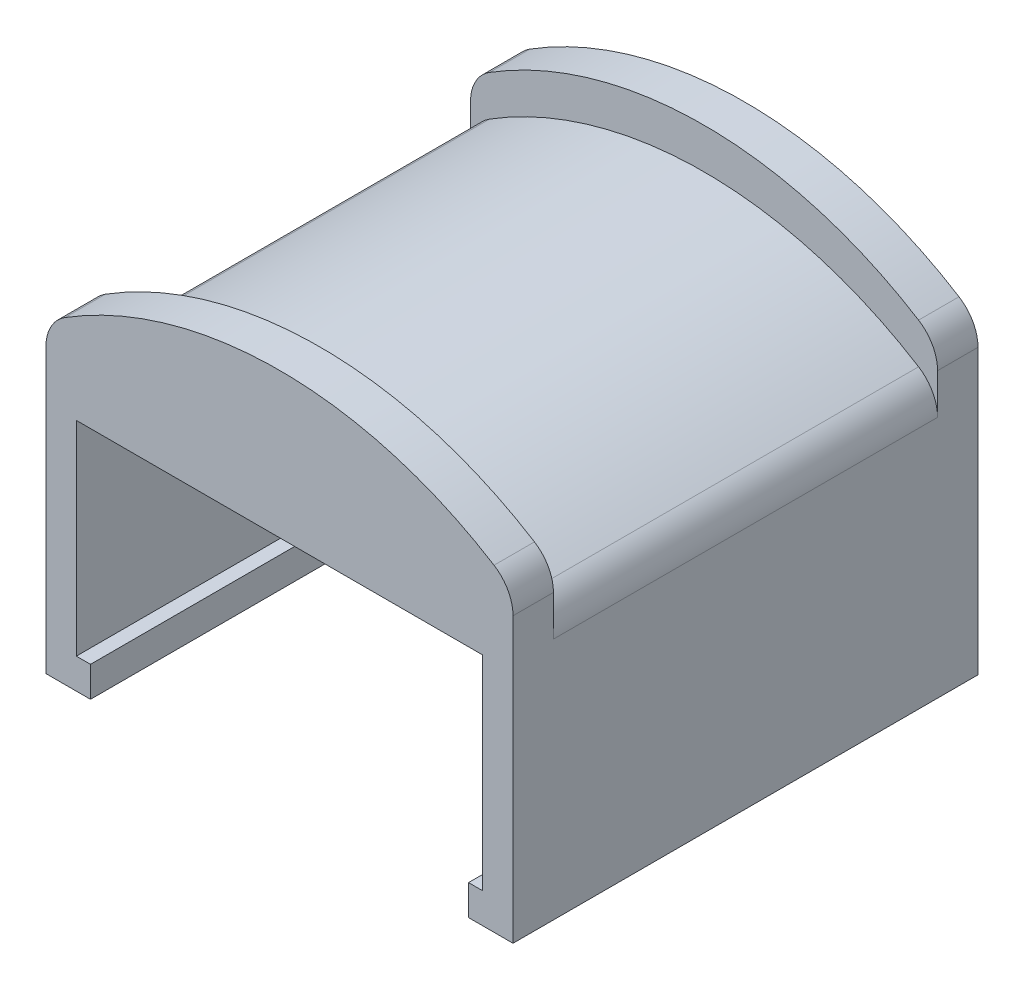
ISO-10303-21;
HEADER;
FILE_DESCRIPTION(('STEP AP214'),'2;1');
FILE_NAME('part.step','',(''),(''),'','','');
FILE_SCHEMA(('AUTOMOTIVE_DESIGN { 1 0 10303 214 1 1 1 1 }'));
ENDSEC;
DATA;
#1=APPLICATION_CONTEXT('core data for automotive mechanical design processes');
#2=APPLICATION_PROTOCOL_DEFINITION('international standard','automotive_design',2000,#1);
#3=PRODUCT_CONTEXT('',#1,'mechanical');
#4=PRODUCT('Part','Part','',(#3));
#5=PRODUCT_RELATED_PRODUCT_CATEGORY('part','',(#4));
#6=PRODUCT_DEFINITION_FORMATION('','',#4);
#7=PRODUCT_DEFINITION_CONTEXT('part definition',#1,'design');
#8=PRODUCT_DEFINITION('design','',#6,#7);
#9=PRODUCT_DEFINITION_SHAPE('','',#8);
#10=(LENGTH_UNIT() NAMED_UNIT(*) SI_UNIT(.MILLI.,.METRE.));
#11=(NAMED_UNIT(*) PLANE_ANGLE_UNIT() SI_UNIT($,.RADIAN.));
#12=(NAMED_UNIT(*) SI_UNIT($,.STERADIAN.) SOLID_ANGLE_UNIT());
#13=UNCERTAINTY_MEASURE_WITH_UNIT(LENGTH_MEASURE(1.E-05),#10,'distance_accuracy_value','');
#14=(GEOMETRIC_REPRESENTATION_CONTEXT(3) GLOBAL_UNCERTAINTY_ASSIGNED_CONTEXT((#13)) GLOBAL_UNIT_ASSIGNED_CONTEXT((#10,
#11,#12)) REPRESENTATION_CONTEXT('',''));
#15=CARTESIAN_POINT('',(0.,0.,0.));
#16=DIRECTION('',(0.,0.,1.));
#17=DIRECTION('',(1.,0.,0.));
#18=AXIS2_PLACEMENT_3D('',#15,#16,#17);
#19=CARTESIAN_POINT('',(-25.527,0.,24.13));
#20=DIRECTION('',(-1.,0.,0.));
#21=DIRECTION('',(0.,0.,1.));
#22=AXIS2_PLACEMENT_3D('',#19,#20,#21);
#23=PLANE('',#22);
#24=DIRECTION('',(0.,0.,-1.));
#25=VECTOR('',#24,1.);
#26=CARTESIAN_POINT('',(-25.527,-25.654,24.13));
#27=LINE('',#26,#25);
#28=CARTESIAN_POINT('',(-25.527,-25.654,29.21));
#29=VERTEX_POINT('',#28);
#30=CARTESIAN_POINT('',(-25.527,-25.654,-29.21));
#31=VERTEX_POINT('',#30);
#32=EDGE_CURVE('E183',#29,#31,#27,.T.);
#33=ORIENTED_EDGE('',*,*,#32,.T.);
#34=DIRECTION('',(0.,1.,0.));
#35=VECTOR('',#34,1.);
#36=CARTESIAN_POINT('',(-25.527,-25.654,-29.21));
#37=LINE('',#36,#35);
#38=CARTESIAN_POINT('',(-25.527,0.,-29.21));
#39=VERTEX_POINT('',#38);
#40=EDGE_CURVE('E185',#31,#39,#37,.T.);
#41=ORIENTED_EDGE('',*,*,#40,.T.);
#42=DIRECTION('',(0.,0.,-1.));
#43=VECTOR('',#42,1.);
#44=CARTESIAN_POINT('',(-25.527,0.,24.13));
#45=LINE('',#44,#43);
#46=CARTESIAN_POINT('',(-25.527,0.,29.21));
#47=VERTEX_POINT('',#46);
#48=EDGE_CURVE('E298',#47,#39,#45,.T.);
#49=ORIENTED_EDGE('',*,*,#48,.F.);
#50=DIRECTION('',(0.,1.,0.));
#51=VECTOR('',#50,1.);
#52=CARTESIAN_POINT('',(-25.527,-25.654,29.21));
#53=LINE('',#52,#51);
#54=EDGE_CURVE('E188',#29,#47,#53,.T.);
#55=ORIENTED_EDGE('',*,*,#54,.F.);
#56=EDGE_LOOP('',(#33,#41,#49,#55));
#57=FACE_BOUND('',#56,.T.);
#58=ADVANCED_FACE('F35',(#57),#23,.F.);
#59=CARTESIAN_POINT('',(-25.527,0.,24.13));
#60=DIRECTION('',(0.,1.,0.));
#61=DIRECTION('',(-1.,0.,0.));
#62=AXIS2_PLACEMENT_3D('',#59,#60,#61);
#63=PLANE('',#62);
#64=ORIENTED_EDGE('',*,*,#48,.T.);
#65=DIRECTION('',(1.,0.,0.));
#66=VECTOR('',#65,1.);
#67=CARTESIAN_POINT('',(-25.527,0.,-29.21));
#68=LINE('',#67,#66);
#69=CARTESIAN_POINT('',(25.527,0.,-29.21));
#70=VERTEX_POINT('',#69);
#71=EDGE_CURVE('E204',#39,#70,#68,.T.);
#72=ORIENTED_EDGE('',*,*,#71,.T.);
#73=DIRECTION('',(0.,0.,-1.));
#74=VECTOR('',#73,1.);
#75=CARTESIAN_POINT('',(25.527,0.,24.13));
#76=LINE('',#75,#74);
#77=CARTESIAN_POINT('',(25.527,0.,29.21));
#78=VERTEX_POINT('',#77);
#79=EDGE_CURVE('E296',#78,#70,#76,.T.);
#80=ORIENTED_EDGE('',*,*,#79,.F.);
#81=DIRECTION('',(1.,0.,0.));
#82=VECTOR('',#81,1.);
#83=CARTESIAN_POINT('',(-25.527,0.,29.21));
#84=LINE('',#83,#82);
#85=EDGE_CURVE('E243',#47,#78,#84,.T.);
#86=ORIENTED_EDGE('',*,*,#85,.F.);
#87=EDGE_LOOP('',(#64,#72,#80,#86));
#88=FACE_BOUND('',#87,.T.);
#89=ADVANCED_FACE('F422',(#88),#63,.F.);
#90=CARTESIAN_POINT('',(25.527,0.,24.13));
#91=DIRECTION('',(1.,0.,0.));
#92=DIRECTION('',(0.,0.,-1.));
#93=AXIS2_PLACEMENT_3D('',#90,#91,#92);
#94=PLANE('',#93);
#95=ORIENTED_EDGE('',*,*,#79,.T.);
#96=DIRECTION('',(0.,-1.,0.));
#97=VECTOR('',#96,1.);
#98=CARTESIAN_POINT('',(25.527,0.,-29.21));
#99=LINE('',#98,#97);
#100=CARTESIAN_POINT('',(25.527,-25.654,-29.21));
#101=VERTEX_POINT('',#100);
#102=EDGE_CURVE('E214',#70,#101,#99,.T.);
#103=ORIENTED_EDGE('',*,*,#102,.T.);
#104=DIRECTION('',(0.,0.,-1.));
#105=VECTOR('',#104,1.);
#106=CARTESIAN_POINT('',(25.527,-25.654,24.13));
#107=LINE('',#106,#105);
#108=CARTESIAN_POINT('',(25.527,-25.654,29.21));
#109=VERTEX_POINT('',#108);
#110=EDGE_CURVE('E294',#109,#101,#107,.T.);
#111=ORIENTED_EDGE('',*,*,#110,.F.);
#112=DIRECTION('',(0.,-1.,0.));
#113=VECTOR('',#112,1.);
#114=CARTESIAN_POINT('',(25.527,0.,29.21));
#115=LINE('',#114,#113);
#116=EDGE_CURVE('E246',#78,#109,#115,.T.);
#117=ORIENTED_EDGE('',*,*,#116,.F.);
#118=EDGE_LOOP('',(#95,#103,#111,#117));
#119=FACE_BOUND('',#118,.T.);
#120=ADVANCED_FACE('F427',(#119),#94,.F.);
#121=CARTESIAN_POINT('',(25.527,-25.654,24.13));
#122=DIRECTION('',(0.,-1.,0.));
#123=DIRECTION('',(0.,0.,-1.));
#124=AXIS2_PLACEMENT_3D('',#121,#122,#123);
#125=PLANE('',#124);
#126=ORIENTED_EDGE('',*,*,#110,.T.);
#127=DIRECTION('',(-1.,0.,0.));
#128=VECTOR('',#127,1.);
#129=CARTESIAN_POINT('',(25.527,-25.654,-29.21));
#130=LINE('',#129,#128);
#131=CARTESIAN_POINT('',(23.749,-25.654,-29.21));
#132=VERTEX_POINT('',#131);
#133=EDGE_CURVE('E217',#101,#132,#130,.T.);
#134=ORIENTED_EDGE('',*,*,#133,.T.);
#135=DIRECTION('',(0.,0.,-1.));
#136=VECTOR('',#135,1.);
#137=CARTESIAN_POINT('',(23.749,-25.654,24.13));
#138=LINE('',#137,#136);
#139=CARTESIAN_POINT('',(23.749,-25.654,29.21));
#140=VERTEX_POINT('',#139);
#141=EDGE_CURVE('E292',#140,#132,#138,.T.);
#142=ORIENTED_EDGE('',*,*,#141,.F.);
#143=DIRECTION('',(-1.,0.,0.));
#144=VECTOR('',#143,1.);
#145=CARTESIAN_POINT('',(25.527,-25.654,29.21));
#146=LINE('',#145,#144);
#147=EDGE_CURVE('E249',#109,#140,#146,.T.);
#148=ORIENTED_EDGE('',*,*,#147,.F.);
#149=EDGE_LOOP('',(#126,#134,#142,#148));
#150=FACE_BOUND('',#149,.T.);
#151=ADVANCED_FACE('F591',(#150),#125,.F.);
#152=CARTESIAN_POINT('',(23.749,-25.654,24.13));
#153=DIRECTION('',(1.,0.,0.));
#154=DIRECTION('',(0.,0.,-1.));
#155=AXIS2_PLACEMENT_3D('',#152,#153,#154);
#156=PLANE('',#155);
#157=ORIENTED_EDGE('',*,*,#141,.T.);
#158=DIRECTION('',(0.,-1.,0.));
#159=VECTOR('',#158,1.);
#160=CARTESIAN_POINT('',(23.749,-25.654,-29.21));
#161=LINE('',#160,#159);
#162=CARTESIAN_POINT('',(23.749,-29.464,-29.21));
#163=VERTEX_POINT('',#162);
#164=EDGE_CURVE('E220',#132,#163,#161,.T.);
#165=ORIENTED_EDGE('',*,*,#164,.T.);
#166=DIRECTION('',(0.,0.,-1.));
#167=VECTOR('',#166,1.);
#168=CARTESIAN_POINT('',(23.749,-29.464,24.13));
#169=LINE('',#168,#167);
#170=CARTESIAN_POINT('',(23.749,-29.464,29.21));
#171=VERTEX_POINT('',#170);
#172=EDGE_CURVE('E290',#171,#163,#169,.T.);
#173=ORIENTED_EDGE('',*,*,#172,.F.);
#174=DIRECTION('',(0.,-1.,0.));
#175=VECTOR('',#174,1.);
#176=CARTESIAN_POINT('',(23.749,-25.654,29.21));
#177=LINE('',#176,#175);
#178=EDGE_CURVE('E252',#140,#171,#177,.T.);
#179=ORIENTED_EDGE('',*,*,#178,.F.);
#180=EDGE_LOOP('',(#157,#165,#173,#179));
#181=FACE_BOUND('',#180,.T.);
#182=ADVANCED_FACE('F580',(#181),#156,.F.);
#183=CARTESIAN_POINT('',(23.749,-29.464,24.13));
#184=DIRECTION('',(0.,1.,0.));
#185=DIRECTION('',(0.,0.,1.));
#186=AXIS2_PLACEMENT_3D('',#183,#184,#185);
#187=PLANE('',#186);
#188=ORIENTED_EDGE('',*,*,#172,.T.);
#189=DIRECTION('',(1.,0.,0.));
#190=VECTOR('',#189,1.);
#191=CARTESIAN_POINT('',(23.749,-29.464,-29.21));
#192=LINE('',#191,#190);
#193=CARTESIAN_POINT('',(29.337,-29.464,-29.21));
#194=VERTEX_POINT('',#193);
#195=EDGE_CURVE('E223',#163,#194,#192,.T.);
#196=ORIENTED_EDGE('',*,*,#195,.T.);
#197=DIRECTION('',(0.,0.,-1.));
#198=VECTOR('',#197,1.);
#199=CARTESIAN_POINT('',(29.337,-29.464,24.13));
#200=LINE('',#199,#198);
#201=CARTESIAN_POINT('',(29.337,-29.464,29.21));
#202=VERTEX_POINT('',#201);
#203=EDGE_CURVE('E288',#202,#194,#200,.T.);
#204=ORIENTED_EDGE('',*,*,#203,.F.);
#205=DIRECTION('',(1.,0.,0.));
#206=VECTOR('',#205,1.);
#207=CARTESIAN_POINT('',(23.749,-29.464,29.21));
#208=LINE('',#207,#206);
#209=EDGE_CURVE('E255',#171,#202,#208,.T.);
#210=ORIENTED_EDGE('',*,*,#209,.F.);
#211=EDGE_LOOP('',(#188,#196,#204,#210));
#212=FACE_BOUND('',#211,.T.);
#213=ADVANCED_FACE('F548',(#212),#187,.F.);
#214=CARTESIAN_POINT('',(29.337,-29.464,24.13));
#215=DIRECTION('',(-1.,0.,0.));
#216=DIRECTION('',(0.,0.,1.));
#217=AXIS2_PLACEMENT_3D('',#214,#215,#216);
#218=PLANE('',#217);
#219=DIRECTION('',(0.,1.,0.));
#220=VECTOR('',#219,1.);
#221=CARTESIAN_POINT('',(29.337,-29.464,-29.21));
#222=LINE('',#221,#220);
#223=CARTESIAN_POINT('',(29.337,6.17191876965705,-29.21));
#224=VERTEX_POINT('',#223);
#225=EDGE_CURVE('E226',#194,#224,#222,.T.);
#226=ORIENTED_EDGE('',*,*,#225,.T.);
#227=DIRECTION('',(0.,0.,-1.));
#228=VECTOR('',#227,1.);
#229=CARTESIAN_POINT('',(29.337,6.17191876965705,24.13));
#230=LINE('',#229,#228);
#231=CARTESIAN_POINT('',(29.337,6.17191876965705,-24.13));
#232=VERTEX_POINT('',#231);
#233=EDGE_CURVE('E344',#224,#232,#230,.F.);
#234=ORIENTED_EDGE('',*,*,#233,.T.);
#235=DIRECTION('',(0.,1.,0.));
#236=VECTOR('',#235,1.);
#237=CARTESIAN_POINT('',(29.337,-29.464,-24.13));
#238=LINE('',#237,#236);
#239=CARTESIAN_POINT('',(29.337,1.09191876965705,-24.13));
#240=VERTEX_POINT('',#239);
#241=EDGE_CURVE('E50',#240,#232,#238,.T.);
#242=ORIENTED_EDGE('',*,*,#241,.F.);
#243=DIRECTION('',(0.,0.,-1.));
#244=VECTOR('',#243,1.);
#245=CARTESIAN_POINT('',(29.337,1.09191876965705,24.13));
#246=LINE('',#245,#244);
#247=CARTESIAN_POINT('',(29.337,1.09191876965705,24.13));
#248=VERTEX_POINT('',#247);
#249=EDGE_CURVE('E340',#240,#248,#246,.F.);
#250=ORIENTED_EDGE('',*,*,#249,.T.);
#251=DIRECTION('',(0.,1.,0.));
#252=VECTOR('',#251,1.);
#253=CARTESIAN_POINT('',(29.337,-29.464,24.13));
#254=LINE('',#253,#252);
#255=CARTESIAN_POINT('',(29.337,6.17191876965705,24.13));
#256=VERTEX_POINT('',#255);
#257=EDGE_CURVE('E57',#248,#256,#254,.T.);
#258=ORIENTED_EDGE('',*,*,#257,.T.);
#259=DIRECTION('',(0.,0.,-1.));
#260=VECTOR('',#259,1.);
#261=CARTESIAN_POINT('',(29.337,6.17191876965705,24.13));
#262=LINE('',#261,#260);
#263=CARTESIAN_POINT('',(29.337,6.17191876965705,29.21));
#264=VERTEX_POINT('',#263);
#265=EDGE_CURVE('E342',#256,#264,#262,.F.);
#266=ORIENTED_EDGE('',*,*,#265,.T.);
#267=DIRECTION('',(0.,1.,0.));
#268=VECTOR('',#267,1.);
#269=CARTESIAN_POINT('',(29.337,-29.464,29.21));
#270=LINE('',#269,#268);
#271=EDGE_CURVE('E258',#202,#264,#270,.T.);
#272=ORIENTED_EDGE('',*,*,#271,.F.);
#273=ORIENTED_EDGE('',*,*,#203,.T.);
#274=EDGE_LOOP('',(#226,#234,#242,#250,#258,#266,#272,#273));
#275=FACE_BOUND('',#274,.T.);
#276=ADVANCED_FACE('F359',(#275),#218,.F.);
#277=CARTESIAN_POINT('',(0.,-37.6626467807397,24.13));
#278=DIRECTION('',(0.,0.,-1.));
#279=DIRECTION('',(-1.,0.,0.));
#280=AXIS2_PLACEMENT_3D('',#277,#278,#279);
#281=CYLINDRICAL_SURFACE('',#280,50.8);
#282=CARTESIAN_POINT('',(0.,-37.6626467807397,-24.13));
#283=DIRECTION('',(0.,0.,1.));
#284=DIRECTION('',(-1.,0.,0.));
#285=AXIS2_PLACEMENT_3D('',#282,#283,#284);
#286=CIRCLE('',#285,50.8);
#287=CARTESIAN_POINT('',(26.9522222222222,5.39798160859003,-24.13));
#288=VERTEX_POINT('',#287);
#289=CARTESIAN_POINT('',(-26.9522222222222,5.39798160859003,-24.13));
#290=VERTEX_POINT('',#289);
#291=EDGE_CURVE('E272',#288,#290,#286,.T.);
#292=ORIENTED_EDGE('',*,*,#291,.T.);
#293=DIRECTION('',(0.,0.,-1.));
#294=VECTOR('',#293,1.);
#295=CARTESIAN_POINT('',(-26.9522222222222,5.39798160859003,24.13));
#296=LINE('',#295,#294);
#297=CARTESIAN_POINT('',(-26.9522222222222,5.39798160859003,24.13));
#298=VERTEX_POINT('',#297);
#299=EDGE_CURVE('E325',#290,#298,#296,.F.);
#300=ORIENTED_EDGE('',*,*,#299,.T.);
#301=CARTESIAN_POINT('',(0.,-37.6626467807397,24.13));
#302=DIRECTION('',(0.,0.,1.));
#303=DIRECTION('',(-1.,0.,0.));
#304=AXIS2_PLACEMENT_3D('',#301,#302,#303);
#305=CIRCLE('',#304,50.8);
#306=CARTESIAN_POINT('',(26.9522222222222,5.39798160859003,24.13));
#307=VERTEX_POINT('',#306);
#308=EDGE_CURVE('E194',#307,#298,#305,.T.);
#309=ORIENTED_EDGE('',*,*,#308,.F.);
#310=DIRECTION('',(0.,0.,-1.));
#311=VECTOR('',#310,1.);
#312=CARTESIAN_POINT('',(26.9522222222222,5.39798160859003,24.13));
#313=LINE('',#312,#311);
#314=EDGE_CURVE('E322',#307,#288,#313,.T.);
#315=ORIENTED_EDGE('',*,*,#314,.T.);
#316=EDGE_LOOP('',(#292,#300,#309,#315));
#317=FACE_BOUND('',#316,.T.);
#318=ADVANCED_FACE('F409',(#317),#281,.T.);
#319=CARTESIAN_POINT('',(-29.337,-29.464,24.13));
#320=DIRECTION('',(1.,0.,0.));
#321=DIRECTION('',(0.,0.,-1.));
#322=AXIS2_PLACEMENT_3D('',#319,#320,#321);
#323=PLANE('',#322);
#324=DIRECTION('',(0.,-1.,0.));
#325=VECTOR('',#324,1.);
#326=CARTESIAN_POINT('',(-29.337,-29.464,-24.13));
#327=LINE('',#326,#325);
#328=CARTESIAN_POINT('',(-29.337,6.17191876965703,-24.13));
#329=VERTEX_POINT('',#328);
#330=CARTESIAN_POINT('',(-29.337,1.09191876965705,-24.13));
#331=VERTEX_POINT('',#330);
#332=EDGE_CURVE('E210',#329,#331,#327,.T.);
#333=ORIENTED_EDGE('',*,*,#332,.F.);
#334=DIRECTION('',(0.,0.,-1.));
#335=VECTOR('',#334,1.);
#336=CARTESIAN_POINT('',(-29.337,6.17191876965705,24.13));
#337=LINE('',#336,#335);
#338=CARTESIAN_POINT('',(-29.337,6.17191876965703,-29.21));
#339=VERTEX_POINT('',#338);
#340=EDGE_CURVE('E306',#329,#339,#337,.T.);
#341=ORIENTED_EDGE('',*,*,#340,.T.);
#342=DIRECTION('',(0.,-1.,0.));
#343=VECTOR('',#342,1.);
#344=CARTESIAN_POINT('',(-29.337,-29.464,-29.21));
#345=LINE('',#344,#343);
#346=CARTESIAN_POINT('',(-29.337,-29.464,-29.21));
#347=VERTEX_POINT('',#346);
#348=EDGE_CURVE('E232',#339,#347,#345,.T.);
#349=ORIENTED_EDGE('',*,*,#348,.T.);
#350=DIRECTION('',(0.,0.,-1.));
#351=VECTOR('',#350,1.);
#352=CARTESIAN_POINT('',(-29.337,-29.464,24.13));
#353=LINE('',#352,#351);
#354=CARTESIAN_POINT('',(-29.337,-29.464,29.21));
#355=VERTEX_POINT('',#354);
#356=EDGE_CURVE('E285',#355,#347,#353,.T.);
#357=ORIENTED_EDGE('',*,*,#356,.F.);
#358=DIRECTION('',(0.,-1.,0.));
#359=VECTOR('',#358,1.);
#360=CARTESIAN_POINT('',(-29.337,-29.464,29.21));
#361=LINE('',#360,#359);
#362=CARTESIAN_POINT('',(-29.337,6.17191876965703,29.21));
#363=VERTEX_POINT('',#362);
#364=EDGE_CURVE('E264',#363,#355,#361,.T.);
#365=ORIENTED_EDGE('',*,*,#364,.F.);
#366=DIRECTION('',(0.,0.,-1.));
#367=VECTOR('',#366,1.);
#368=CARTESIAN_POINT('',(-29.337,6.17191876965705,24.13));
#369=LINE('',#368,#367);
#370=CARTESIAN_POINT('',(-29.337,6.17191876965703,24.13));
#371=VERTEX_POINT('',#370);
#372=EDGE_CURVE('E300',#363,#371,#369,.T.);
#373=ORIENTED_EDGE('',*,*,#372,.T.);
#374=DIRECTION('',(0.,-1.,0.));
#375=VECTOR('',#374,1.);
#376=CARTESIAN_POINT('',(-29.337,-29.464,24.13));
#377=LINE('',#376,#375);
#378=CARTESIAN_POINT('',(-29.337,1.09191876965704,24.13));
#379=VERTEX_POINT('',#378);
#380=EDGE_CURVE('E241',#371,#379,#377,.T.);
#381=ORIENTED_EDGE('',*,*,#380,.T.);
#382=DIRECTION('',(0.,0.,-1.));
#383=VECTOR('',#382,1.);
#384=CARTESIAN_POINT('',(-29.337,1.09191876965705,24.13));
#385=LINE('',#384,#383);
#386=EDGE_CURVE('E303',#379,#331,#385,.T.);
#387=ORIENTED_EDGE('',*,*,#386,.T.);
#388=EDGE_LOOP('',(#333,#341,#349,#357,#365,#373,#381,#387));
#389=FACE_BOUND('',#388,.T.);
#390=ADVANCED_FACE('F381',(#389),#323,.F.);
#391=CARTESIAN_POINT('',(-23.749,-29.464,24.13));
#392=DIRECTION('',(0.,1.,0.));
#393=DIRECTION('',(0.,0.,1.));
#394=AXIS2_PLACEMENT_3D('',#391,#392,#393);
#395=PLANE('',#394);
#396=ORIENTED_EDGE('',*,*,#356,.T.);
#397=DIRECTION('',(1.,0.,0.));
#398=VECTOR('',#397,1.);
#399=CARTESIAN_POINT('',(-29.337,-29.464,-29.21));
#400=LINE('',#399,#398);
#401=CARTESIAN_POINT('',(-23.749,-29.464,-29.21));
#402=VERTEX_POINT('',#401);
#403=EDGE_CURVE('E234',#347,#402,#400,.T.);
#404=ORIENTED_EDGE('',*,*,#403,.T.);
#405=DIRECTION('',(0.,0.,-1.));
#406=VECTOR('',#405,1.);
#407=CARTESIAN_POINT('',(-23.749,-29.464,24.13));
#408=LINE('',#407,#406);
#409=CARTESIAN_POINT('',(-23.749,-29.464,29.21));
#410=VERTEX_POINT('',#409);
#411=EDGE_CURVE('E283',#410,#402,#408,.T.);
#412=ORIENTED_EDGE('',*,*,#411,.F.);
#413=DIRECTION('',(1.,0.,0.));
#414=VECTOR('',#413,1.);
#415=CARTESIAN_POINT('',(-29.337,-29.464,29.21));
#416=LINE('',#415,#414);
#417=EDGE_CURVE('E266',#355,#410,#416,.T.);
#418=ORIENTED_EDGE('',*,*,#417,.F.);
#419=EDGE_LOOP('',(#396,#404,#412,#418));
#420=FACE_BOUND('',#419,.T.);
#421=ADVANCED_FACE('F386',(#420),#395,.F.);
#422=CARTESIAN_POINT('',(-23.749,-25.654,24.13));
#423=DIRECTION('',(-1.,0.,0.));
#424=DIRECTION('',(0.,0.,1.));
#425=AXIS2_PLACEMENT_3D('',#422,#423,#424);
#426=PLANE('',#425);
#427=ORIENTED_EDGE('',*,*,#411,.T.);
#428=DIRECTION('',(0.,1.,0.));
#429=VECTOR('',#428,1.);
#430=CARTESIAN_POINT('',(-23.749,-29.464,-29.21));
#431=LINE('',#430,#429);
#432=CARTESIAN_POINT('',(-23.749,-25.654,-29.21));
#433=VERTEX_POINT('',#432);
#434=EDGE_CURVE('E237',#402,#433,#431,.T.);
#435=ORIENTED_EDGE('',*,*,#434,.T.);
#436=DIRECTION('',(0.,0.,-1.));
#437=VECTOR('',#436,1.);
#438=CARTESIAN_POINT('',(-23.749,-25.654,24.13));
#439=LINE('',#438,#437);
#440=CARTESIAN_POINT('',(-23.749,-25.654,29.21));
#441=VERTEX_POINT('',#440);
#442=EDGE_CURVE('E193',#441,#433,#439,.T.);
#443=ORIENTED_EDGE('',*,*,#442,.F.);
#444=DIRECTION('',(0.,1.,0.));
#445=VECTOR('',#444,1.);
#446=CARTESIAN_POINT('',(-23.749,-29.464,29.21));
#447=LINE('',#446,#445);
#448=EDGE_CURVE('E269',#410,#441,#447,.T.);
#449=ORIENTED_EDGE('',*,*,#448,.F.);
#450=EDGE_LOOP('',(#427,#435,#443,#449));
#451=FACE_BOUND('',#450,.T.);
#452=ADVANCED_FACE('F389',(#451),#426,.F.);
#453=CARTESIAN_POINT('',(-25.527,-25.654,24.13));
#454=DIRECTION('',(0.,-1.,0.));
#455=DIRECTION('',(0.,0.,-1.));
#456=AXIS2_PLACEMENT_3D('',#453,#454,#455);
#457=PLANE('',#456);
#458=ORIENTED_EDGE('',*,*,#442,.T.);
#459=DIRECTION('',(-1.,0.,0.));
#460=VECTOR('',#459,1.);
#461=CARTESIAN_POINT('',(-23.749,-25.654,-29.21));
#462=LINE('',#461,#460);
#463=EDGE_CURVE('E201',#433,#31,#462,.T.);
#464=ORIENTED_EDGE('',*,*,#463,.T.);
#465=ORIENTED_EDGE('',*,*,#32,.F.);
#466=DIRECTION('',(-1.,0.,0.));
#467=VECTOR('',#466,1.);
#468=CARTESIAN_POINT('',(-23.749,-25.654,29.21));
#469=LINE('',#468,#467);
#470=EDGE_CURVE('E239',#441,#29,#469,.T.);
#471=ORIENTED_EDGE('',*,*,#470,.F.);
#472=EDGE_LOOP('',(#458,#464,#465,#471));
#473=FACE_BOUND('',#472,.T.);
#474=ADVANCED_FACE('F206',(#473),#457,.F.);
#475=CARTESIAN_POINT('',(0.,-32.5826467807397,29.21));
#476=DIRECTION('',(0.,0.,-1.));
#477=DIRECTION('',(-1.,0.,0.));
#478=AXIS2_PLACEMENT_3D('',#475,#476,#477);
#479=CYLINDRICAL_SURFACE('',#478,50.8);
#480=CARTESIAN_POINT('',(0.,-32.5826467807397,24.13));
#481=DIRECTION('',(0.,0.,1.));
#482=DIRECTION('',(-1.,0.,0.));
#483=AXIS2_PLACEMENT_3D('',#480,#481,#482);
#484=CIRCLE('',#483,50.8);
#485=CARTESIAN_POINT('',(26.9522222222222,10.47798160859,24.13));
#486=VERTEX_POINT('',#485);
#487=CARTESIAN_POINT('',(-26.9522222222222,10.47798160859,24.13));
#488=VERTEX_POINT('',#487);
#489=EDGE_CURVE('E274',#486,#488,#484,.T.);
#490=ORIENTED_EDGE('',*,*,#489,.T.);
#491=DIRECTION('',(0.,0.,-1.));
#492=VECTOR('',#491,1.);
#493=CARTESIAN_POINT('',(-26.9522222222222,10.47798160859,29.21));
#494=LINE('',#493,#492);
#495=CARTESIAN_POINT('',(-26.9522222222222,10.47798160859,29.21));
#496=VERTEX_POINT('',#495);
#497=EDGE_CURVE('E334',#488,#496,#494,.F.);
#498=ORIENTED_EDGE('',*,*,#497,.T.);
#499=CARTESIAN_POINT('',(0.,-32.5826467807397,29.21));
#500=DIRECTION('',(0.,0.,1.));
#501=DIRECTION('',(-1.,0.,0.));
#502=AXIS2_PLACEMENT_3D('',#499,#500,#501);
#503=CIRCLE('',#502,50.8);
#504=CARTESIAN_POINT('',(26.9522222222222,10.47798160859,29.21));
#505=VERTEX_POINT('',#504);
#506=EDGE_CURVE('E261',#505,#496,#503,.T.);
#507=ORIENTED_EDGE('',*,*,#506,.F.);
#508=DIRECTION('',(0.,0.,-1.));
#509=VECTOR('',#508,1.);
#510=CARTESIAN_POINT('',(26.9522222222222,10.47798160859,29.21));
#511=LINE('',#510,#509);
#512=EDGE_CURVE('E331',#505,#486,#511,.T.);
#513=ORIENTED_EDGE('',*,*,#512,.T.);
#514=EDGE_LOOP('',(#490,#498,#507,#513));
#515=FACE_BOUND('',#514,.T.);
#516=ADVANCED_FACE('F371',(#515),#479,.T.);
#517=CARTESIAN_POINT('',(0.,-32.5826467807397,29.21));
#518=DIRECTION('',(0.,0.,-1.));
#519=DIRECTION('',(-1.,0.,0.));
#520=AXIS2_PLACEMENT_3D('',#517,#518,#519);
#521=PLANE('',#520);
#522=ORIENTED_EDGE('',*,*,#506,.T.);
#523=CARTESIAN_POINT('',(-24.257,6.17191876965705,29.21));
#524=DIRECTION('',(0.,0.,-1.));
#525=DIRECTION('',(-1.,0.,0.));
#526=AXIS2_PLACEMENT_3D('',#523,#524,#525);
#527=CIRCLE('',#526,5.08);
#528=EDGE_CURVE('E338',#496,#363,#527,.F.);
#529=ORIENTED_EDGE('',*,*,#528,.T.);
#530=ORIENTED_EDGE('',*,*,#364,.T.);
#531=ORIENTED_EDGE('',*,*,#417,.T.);
#532=ORIENTED_EDGE('',*,*,#448,.T.);
#533=ORIENTED_EDGE('',*,*,#470,.T.);
#534=ORIENTED_EDGE('',*,*,#54,.T.);
#535=ORIENTED_EDGE('',*,*,#85,.T.);
#536=ORIENTED_EDGE('',*,*,#116,.T.);
#537=ORIENTED_EDGE('',*,*,#147,.T.);
#538=ORIENTED_EDGE('',*,*,#178,.T.);
#539=ORIENTED_EDGE('',*,*,#209,.T.);
#540=ORIENTED_EDGE('',*,*,#271,.T.);
#541=CARTESIAN_POINT('',(24.257,6.17191876965705,29.21));
#542=DIRECTION('',(0.,0.,-1.));
#543=DIRECTION('',(-1.,0.,0.));
#544=AXIS2_PLACEMENT_3D('',#541,#542,#543);
#545=CIRCLE('',#544,5.08);
#546=EDGE_CURVE('E336',#264,#505,#545,.F.);
#547=ORIENTED_EDGE('',*,*,#546,.T.);
#548=EDGE_LOOP('',(#522,#529,#530,#531,#532,#533,#534,#535,#536,#537,#538,#539,#540,#547));
#549=FACE_BOUND('',#548,.T.);
#550=ADVANCED_FACE('F368',(#549),#521,.F.);
#551=CARTESIAN_POINT('',(0.,-32.5826467807397,24.13));
#552=DIRECTION('',(0.,0.,-1.));
#553=DIRECTION('',(-1.,0.,0.));
#554=AXIS2_PLACEMENT_3D('',#551,#552,#553);
#555=PLANE('',#554);
#556=ORIENTED_EDGE('',*,*,#380,.F.);
#557=CARTESIAN_POINT('',(-24.257,6.17191876965705,24.13));
#558=DIRECTION('',(0.,0.,-1.));
#559=DIRECTION('',(-1.,0.,0.));
#560=AXIS2_PLACEMENT_3D('',#557,#558,#559);
#561=CIRCLE('',#560,5.08);
#562=EDGE_CURVE('E329',#371,#488,#561,.T.);
#563=ORIENTED_EDGE('',*,*,#562,.T.);
#564=ORIENTED_EDGE('',*,*,#489,.F.);
#565=CARTESIAN_POINT('',(24.257,6.17191876965705,24.13));
#566=DIRECTION('',(0.,0.,-1.));
#567=DIRECTION('',(-1.,0.,0.));
#568=AXIS2_PLACEMENT_3D('',#565,#566,#567);
#569=CIRCLE('',#568,5.08);
#570=EDGE_CURVE('E327',#486,#256,#569,.T.);
#571=ORIENTED_EDGE('',*,*,#570,.T.);
#572=ORIENTED_EDGE('',*,*,#257,.F.);
#573=CARTESIAN_POINT('',(24.257,1.09191876965705,24.13));
#574=DIRECTION('',(0.,0.,-1.));
#575=DIRECTION('',(-1.,0.,0.));
#576=AXIS2_PLACEMENT_3D('',#573,#574,#575);
#577=CIRCLE('',#576,5.08);
#578=EDGE_CURVE('E11',#248,#307,#577,.F.);
#579=ORIENTED_EDGE('',*,*,#578,.T.);
#580=ORIENTED_EDGE('',*,*,#308,.T.);
#581=CARTESIAN_POINT('',(-24.257,1.09191876965705,24.13));
#582=DIRECTION('',(0.,0.,-1.));
#583=DIRECTION('',(-1.,0.,0.));
#584=AXIS2_PLACEMENT_3D('',#581,#582,#583);
#585=CIRCLE('',#584,5.08);
#586=EDGE_CURVE('E348',#298,#379,#585,.F.);
#587=ORIENTED_EDGE('',*,*,#586,.T.);
#588=EDGE_LOOP('',(#556,#563,#564,#571,#572,#579,#580,#587));
#589=FACE_BOUND('',#588,.T.);
#590=ADVANCED_FACE('F411',(#589),#555,.T.);
#591=CARTESIAN_POINT('',(0.,-32.5826467807397,-24.13));
#592=DIRECTION('',(0.,0.,-1.));
#593=DIRECTION('',(-1.,0.,0.));
#594=AXIS2_PLACEMENT_3D('',#591,#592,#593);
#595=CYLINDRICAL_SURFACE('',#594,50.8);
#596=CARTESIAN_POINT('',(0.,-32.5826467807397,-29.21));
#597=DIRECTION('',(0.,0.,1.));
#598=DIRECTION('',(-1.,0.,0.));
#599=AXIS2_PLACEMENT_3D('',#596,#597,#598);
#600=CIRCLE('',#599,50.8);
#601=CARTESIAN_POINT('',(26.9522222222222,10.47798160859,-29.21));
#602=VERTEX_POINT('',#601);
#603=CARTESIAN_POINT('',(-26.9522222222222,10.47798160859,-29.21));
#604=VERTEX_POINT('',#603);
#605=EDGE_CURVE('E229',#602,#604,#600,.T.);
#606=ORIENTED_EDGE('',*,*,#605,.T.);
#607=DIRECTION('',(0.,0.,-1.));
#608=VECTOR('',#607,1.);
#609=CARTESIAN_POINT('',(-26.9522222222222,10.47798160859,-24.13));
#610=LINE('',#609,#608);
#611=CARTESIAN_POINT('',(-26.9522222222222,10.47798160859,-24.13));
#612=VERTEX_POINT('',#611);
#613=EDGE_CURVE('E316',#604,#612,#610,.F.);
#614=ORIENTED_EDGE('',*,*,#613,.T.);
#615=CARTESIAN_POINT('',(0.,-32.5826467807397,-24.13));
#616=DIRECTION('',(0.,0.,1.));
#617=DIRECTION('',(-1.,0.,0.));
#618=AXIS2_PLACEMENT_3D('',#615,#616,#617);
#619=CIRCLE('',#618,50.8);
#620=CARTESIAN_POINT('',(26.9522222222222,10.47798160859,-24.13));
#621=VERTEX_POINT('',#620);
#622=EDGE_CURVE('E401',#621,#612,#619,.T.);
#623=ORIENTED_EDGE('',*,*,#622,.F.);
#624=DIRECTION('',(0.,0.,-1.));
#625=VECTOR('',#624,1.);
#626=CARTESIAN_POINT('',(26.9522222222222,10.47798160859,-24.13));
#627=LINE('',#626,#625);
#628=EDGE_CURVE('E313',#621,#602,#627,.T.);
#629=ORIENTED_EDGE('',*,*,#628,.T.);
#630=EDGE_LOOP('',(#606,#614,#623,#629));
#631=FACE_BOUND('',#630,.T.);
#632=ADVANCED_FACE('F395',(#631),#595,.T.);
#633=CARTESIAN_POINT('',(0.,-32.5826467807397,-24.13));
#634=DIRECTION('',(0.,0.,-1.));
#635=DIRECTION('',(-1.,0.,0.));
#636=AXIS2_PLACEMENT_3D('',#633,#634,#635);
#637=PLANE('',#636);
#638=ORIENTED_EDGE('',*,*,#622,.T.);
#639=CARTESIAN_POINT('',(-24.257,6.17191876965705,-24.13));
#640=DIRECTION('',(0.,0.,-1.));
#641=DIRECTION('',(-1.,0.,0.));
#642=AXIS2_PLACEMENT_3D('',#639,#640,#641);
#643=CIRCLE('',#642,5.08);
#644=EDGE_CURVE('E320',#612,#329,#643,.F.);
#645=ORIENTED_EDGE('',*,*,#644,.T.);
#646=ORIENTED_EDGE('',*,*,#332,.T.);
#647=CARTESIAN_POINT('',(-24.257,1.09191876965705,-24.13));
#648=DIRECTION('',(0.,0.,-1.));
#649=DIRECTION('',(-1.,0.,0.));
#650=AXIS2_PLACEMENT_3D('',#647,#648,#649);
#651=CIRCLE('',#650,5.08);
#652=EDGE_CURVE('E346',#331,#290,#651,.T.);
#653=ORIENTED_EDGE('',*,*,#652,.T.);
#654=ORIENTED_EDGE('',*,*,#291,.F.);
#655=CARTESIAN_POINT('',(24.257,1.09191876965705,-24.13));
#656=DIRECTION('',(0.,0.,-1.));
#657=DIRECTION('',(-1.,0.,0.));
#658=AXIS2_PLACEMENT_3D('',#655,#656,#657);
#659=CIRCLE('',#658,5.08);
#660=EDGE_CURVE('E43',#288,#240,#659,.T.);
#661=ORIENTED_EDGE('',*,*,#660,.T.);
#662=ORIENTED_EDGE('',*,*,#241,.T.);
#663=CARTESIAN_POINT('',(24.257,6.17191876965705,-24.13));
#664=DIRECTION('',(0.,0.,-1.));
#665=DIRECTION('',(-1.,0.,0.));
#666=AXIS2_PLACEMENT_3D('',#663,#664,#665);
#667=CIRCLE('',#666,5.08);
#668=EDGE_CURVE('E318',#232,#621,#667,.F.);
#669=ORIENTED_EDGE('',*,*,#668,.T.);
#670=EDGE_LOOP('',(#638,#645,#646,#653,#654,#661,#662,#669));
#671=FACE_BOUND('',#670,.T.);
#672=ADVANCED_FACE('F354',(#671),#637,.F.);
#673=CARTESIAN_POINT('',(0.,-32.5826467807397,-29.21));
#674=DIRECTION('',(0.,0.,-1.));
#675=DIRECTION('',(-1.,0.,0.));
#676=AXIS2_PLACEMENT_3D('',#673,#674,#675);
#677=PLANE('',#676);
#678=ORIENTED_EDGE('',*,*,#348,.F.);
#679=CARTESIAN_POINT('',(-24.257,6.17191876965705,-29.21));
#680=DIRECTION('',(0.,0.,-1.));
#681=DIRECTION('',(-1.,0.,0.));
#682=AXIS2_PLACEMENT_3D('',#679,#680,#681);
#683=CIRCLE('',#682,5.08);
#684=EDGE_CURVE('E311',#339,#604,#683,.T.);
#685=ORIENTED_EDGE('',*,*,#684,.T.);
#686=ORIENTED_EDGE('',*,*,#605,.F.);
#687=CARTESIAN_POINT('',(24.257,6.17191876965705,-29.21));
#688=DIRECTION('',(0.,0.,-1.));
#689=DIRECTION('',(-1.,0.,0.));
#690=AXIS2_PLACEMENT_3D('',#687,#688,#689);
#691=CIRCLE('',#690,5.08);
#692=EDGE_CURVE('E309',#602,#224,#691,.T.);
#693=ORIENTED_EDGE('',*,*,#692,.T.);
#694=ORIENTED_EDGE('',*,*,#225,.F.);
#695=ORIENTED_EDGE('',*,*,#195,.F.);
#696=ORIENTED_EDGE('',*,*,#164,.F.);
#697=ORIENTED_EDGE('',*,*,#133,.F.);
#698=ORIENTED_EDGE('',*,*,#102,.F.);
#699=ORIENTED_EDGE('',*,*,#71,.F.);
#700=ORIENTED_EDGE('',*,*,#40,.F.);
#701=ORIENTED_EDGE('',*,*,#463,.F.);
#702=ORIENTED_EDGE('',*,*,#434,.F.);
#703=ORIENTED_EDGE('',*,*,#403,.F.);
#704=EDGE_LOOP('',(#678,#685,#686,#693,#694,#695,#696,#697,#698,#699,#700,#701,#702,#703));
#705=FACE_BOUND('',#704,.T.);
#706=ADVANCED_FACE('F199',(#705),#677,.T.);
#707=CARTESIAN_POINT('',(-24.257,6.17191876965705,-24.13));
#708=DIRECTION('',(0.,0.,-1.));
#709=DIRECTION('',(-1.,0.,0.));
#710=AXIS2_PLACEMENT_3D('',#707,#708,#709);
#711=CYLINDRICAL_SURFACE('',#710,5.08);
#712=ORIENTED_EDGE('',*,*,#644,.F.);
#713=ORIENTED_EDGE('',*,*,#613,.F.);
#714=ORIENTED_EDGE('',*,*,#684,.F.);
#715=ORIENTED_EDGE('',*,*,#340,.F.);
#716=EDGE_LOOP('',(#712,#713,#714,#715));
#717=FACE_BOUND('',#716,.T.);
#718=ADVANCED_FACE('F399',(#717),#711,.T.);
#719=CARTESIAN_POINT('',(-24.257,1.09191876965705,24.13));
#720=DIRECTION('',(0.,0.,-1.));
#721=DIRECTION('',(-1.,0.,0.));
#722=AXIS2_PLACEMENT_3D('',#719,#720,#721);
#723=CYLINDRICAL_SURFACE('',#722,5.08);
#724=ORIENTED_EDGE('',*,*,#586,.F.);
#725=ORIENTED_EDGE('',*,*,#299,.F.);
#726=ORIENTED_EDGE('',*,*,#652,.F.);
#727=ORIENTED_EDGE('',*,*,#386,.F.);
#728=EDGE_LOOP('',(#724,#725,#726,#727));
#729=FACE_BOUND('',#728,.T.);
#730=ADVANCED_FACE('F406',(#729),#723,.T.);
#731=CARTESIAN_POINT('',(-24.257,6.17191876965705,29.21));
#732=DIRECTION('',(0.,0.,-1.));
#733=DIRECTION('',(-1.,0.,0.));
#734=AXIS2_PLACEMENT_3D('',#731,#732,#733);
#735=CYLINDRICAL_SURFACE('',#734,5.08);
#736=ORIENTED_EDGE('',*,*,#528,.F.);
#737=ORIENTED_EDGE('',*,*,#497,.F.);
#738=ORIENTED_EDGE('',*,*,#562,.F.);
#739=ORIENTED_EDGE('',*,*,#372,.F.);
#740=EDGE_LOOP('',(#736,#737,#738,#739));
#741=FACE_BOUND('',#740,.T.);
#742=ADVANCED_FACE('F375',(#741),#735,.T.);
#743=CARTESIAN_POINT('',(24.257,6.17191876965705,-24.13));
#744=DIRECTION('',(0.,0.,-1.));
#745=DIRECTION('',(-1.,0.,0.));
#746=AXIS2_PLACEMENT_3D('',#743,#744,#745);
#747=CYLINDRICAL_SURFACE('',#746,5.08);
#748=ORIENTED_EDGE('',*,*,#668,.F.);
#749=ORIENTED_EDGE('',*,*,#233,.F.);
#750=ORIENTED_EDGE('',*,*,#692,.F.);
#751=ORIENTED_EDGE('',*,*,#628,.F.);
#752=EDGE_LOOP('',(#748,#749,#750,#751));
#753=FACE_BOUND('',#752,.T.);
#754=ADVANCED_FACE('F438',(#753),#747,.T.);
#755=CARTESIAN_POINT('',(24.257,6.17191876965705,29.21));
#756=DIRECTION('',(0.,0.,-1.));
#757=DIRECTION('',(-1.,0.,0.));
#758=AXIS2_PLACEMENT_3D('',#755,#756,#757);
#759=CYLINDRICAL_SURFACE('',#758,5.08);
#760=ORIENTED_EDGE('',*,*,#546,.F.);
#761=ORIENTED_EDGE('',*,*,#265,.F.);
#762=ORIENTED_EDGE('',*,*,#570,.F.);
#763=ORIENTED_EDGE('',*,*,#512,.F.);
#764=EDGE_LOOP('',(#760,#761,#762,#763));
#765=FACE_BOUND('',#764,.T.);
#766=ADVANCED_FACE('F364',(#765),#759,.T.);
#767=CARTESIAN_POINT('',(24.257,1.09191876965705,24.13));
#768=DIRECTION('',(0.,0.,-1.));
#769=DIRECTION('',(-1.,0.,0.));
#770=AXIS2_PLACEMENT_3D('',#767,#768,#769);
#771=CYLINDRICAL_SURFACE('',#770,5.08);
#772=ORIENTED_EDGE('',*,*,#578,.F.);
#773=ORIENTED_EDGE('',*,*,#249,.F.);
#774=ORIENTED_EDGE('',*,*,#660,.F.);
#775=ORIENTED_EDGE('',*,*,#314,.F.);
#776=EDGE_LOOP('',(#772,#773,#774,#775));
#777=FACE_BOUND('',#776,.T.);
#778=ADVANCED_FACE('F37',(#777),#771,.T.);
#779=CLOSED_SHELL('',(#58,#89,#120,#151,#182,#213,#276,#318,#390,#421,#452,#474,#516,#550,#590,
#632,#672,#706,#718,#730,#742,#754,#766,#778));
#780=MANIFOLD_SOLID_BREP('B2',#779);
#781=ADVANCED_BREP_SHAPE_REPRESENTATION('',(#18,#780),#14);
#782=SHAPE_DEFINITION_REPRESENTATION(#9,#781);
ENDSEC;
END-ISO-10303-21;
